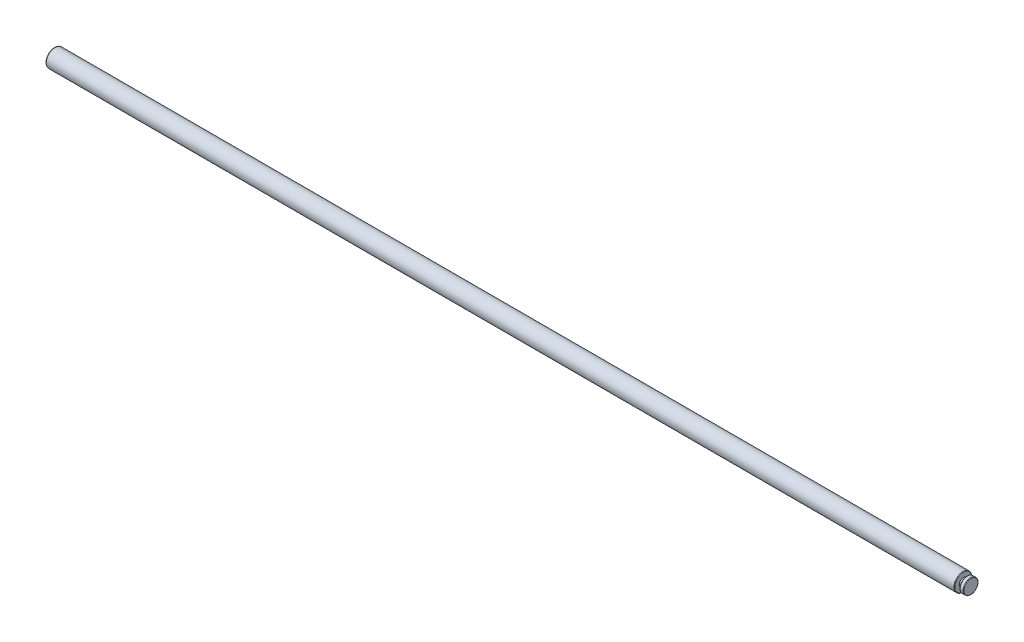
ISO-10303-21;
HEADER;
FILE_DESCRIPTION(('STEP AP214'),'2;1');
FILE_NAME('part.step','',(''),(''),'','','');
FILE_SCHEMA(('AUTOMOTIVE_DESIGN { 1 0 10303 214 1 1 1 1 }'));
ENDSEC;
DATA;
#1=APPLICATION_CONTEXT('core data for automotive mechanical design processes');
#2=APPLICATION_PROTOCOL_DEFINITION('international standard','automotive_design',2000,#1);
#3=PRODUCT_CONTEXT('',#1,'mechanical');
#4=PRODUCT('Part','Part','',(#3));
#5=PRODUCT_RELATED_PRODUCT_CATEGORY('part','',(#4));
#6=PRODUCT_DEFINITION_FORMATION('','',#4);
#7=PRODUCT_DEFINITION_CONTEXT('part definition',#1,'design');
#8=PRODUCT_DEFINITION('design','',#6,#7);
#9=PRODUCT_DEFINITION_SHAPE('','',#8);
#10=(LENGTH_UNIT() NAMED_UNIT(*) SI_UNIT(.MILLI.,.METRE.));
#11=(NAMED_UNIT(*) PLANE_ANGLE_UNIT() SI_UNIT($,.RADIAN.));
#12=(NAMED_UNIT(*) SI_UNIT($,.STERADIAN.) SOLID_ANGLE_UNIT());
#13=UNCERTAINTY_MEASURE_WITH_UNIT(LENGTH_MEASURE(1.E-05),#10,'distance_accuracy_value','');
#14=(GEOMETRIC_REPRESENTATION_CONTEXT(3) GLOBAL_UNCERTAINTY_ASSIGNED_CONTEXT((#13)) GLOBAL_UNIT_ASSIGNED_CONTEXT((#10,
#11,#12)) REPRESENTATION_CONTEXT('',''));
#15=CARTESIAN_POINT('',(0.,0.,0.));
#16=DIRECTION('',(0.,0.,1.));
#17=DIRECTION('',(1.,0.,0.));
#18=AXIS2_PLACEMENT_3D('',#15,#16,#17);
#19=CARTESIAN_POINT('',(-180.,0.,0.));
#20=DIRECTION('',(1.,0.,0.));
#21=DIRECTION('',(0.,0.,-1.));
#22=AXIS2_PLACEMENT_3D('',#19,#20,#21);
#23=PLANE('',#22);
#24=CARTESIAN_POINT('',(-180.,0.,0.));
#25=DIRECTION('',(1.,0.,0.));
#26=DIRECTION('',(0.,0.,-1.));
#27=AXIS2_PLACEMENT_3D('',#24,#25,#26);
#28=CIRCLE('',#27,3.1);
#29=CARTESIAN_POINT('',(-180.,0.,-3.1));
#30=VERTEX_POINT('',#29);
#31=EDGE_CURVE('E38',#30,#30,#28,.F.);
#32=ORIENTED_EDGE('',*,*,#31,.T.);
#33=EDGE_LOOP('',(#32));
#34=FACE_BOUND('',#33,.T.);
#35=ADVANCED_FACE('F31',(#34),#23,.F.);
#36=CARTESIAN_POINT('',(-180.,0.,0.));
#37=DIRECTION('',(-1.,0.,0.));
#38=DIRECTION('',(0.,0.,1.));
#39=AXIS2_PLACEMENT_3D('',#36,#37,#38);
#40=CYLINDRICAL_SURFACE('',#39,3.5);
#41=CARTESIAN_POINT('',(-179.6,0.,0.));
#42=DIRECTION('',(1.,0.,0.));
#43=DIRECTION('',(0.,0.,-1.));
#44=AXIS2_PLACEMENT_3D('',#41,#42,#43);
#45=CIRCLE('',#44,3.5);
#46=CARTESIAN_POINT('',(-179.6,0.,-3.5));
#47=VERTEX_POINT('',#46);
#48=EDGE_CURVE('E10',#47,#47,#45,.T.);
#49=ORIENTED_EDGE('',*,*,#48,.T.);
#50=EDGE_LOOP('',(#49));
#51=FACE_BOUND('',#50,.T.);
#52=CARTESIAN_POINT('',(176.8,0.,0.));
#53=DIRECTION('',(-1.,0.,0.));
#54=DIRECTION('',(0.,0.,1.));
#55=AXIS2_PLACEMENT_3D('',#52,#53,#54);
#56=CIRCLE('',#55,3.5);
#57=CARTESIAN_POINT('',(176.8,0.,3.5));
#58=VERTEX_POINT('',#57);
#59=EDGE_CURVE('E60',#58,#58,#56,.T.);
#60=ORIENTED_EDGE('',*,*,#59,.T.);
#61=EDGE_LOOP('',(#60));
#62=FACE_BOUND('',#61,.T.);
#63=ADVANCED_FACE('F89',(#51,#62),#40,.T.);
#64=CARTESIAN_POINT('',(177.,3.5,0.));
#65=DIRECTION('',(-1.,0.,0.));
#66=DIRECTION('',(0.,0.,1.));
#67=AXIS2_PLACEMENT_3D('',#64,#65,#66);
#68=PLANE('',#67);
#69=CARTESIAN_POINT('',(177.,0.,0.));
#70=DIRECTION('',(-1.,0.,0.));
#71=DIRECTION('',(0.,0.,1.));
#72=AXIS2_PLACEMENT_3D('',#69,#70,#71);
#73=CIRCLE('',#72,3.3);
#74=CARTESIAN_POINT('',(177.,0.,3.3));
#75=VERTEX_POINT('',#74);
#76=EDGE_CURVE('E57',#75,#75,#73,.F.);
#77=ORIENTED_EDGE('',*,*,#76,.T.);
#78=EDGE_LOOP('',(#77));
#79=FACE_BOUND('',#78,.T.);
#80=CARTESIAN_POINT('',(177.,0.,0.));
#81=DIRECTION('',(-1.,0.,0.));
#82=DIRECTION('',(0.,0.,1.));
#83=AXIS2_PLACEMENT_3D('',#80,#81,#82);
#84=CIRCLE('',#83,1.5);
#85=CARTESIAN_POINT('',(177.,0.,1.5));
#86=VERTEX_POINT('',#85);
#87=EDGE_CURVE('E63',#86,#86,#84,.T.);
#88=ORIENTED_EDGE('',*,*,#87,.T.);
#89=EDGE_LOOP('',(#88));
#90=FACE_BOUND('',#89,.T.);
#91=ADVANCED_FACE('F85',(#79,#90),#68,.F.);
#92=CARTESIAN_POINT('',(-180.,0.,0.));
#93=DIRECTION('',(-1.,0.,0.));
#94=DIRECTION('',(0.,0.,1.));
#95=AXIS2_PLACEMENT_3D('',#92,#93,#94);
#96=CYLINDRICAL_SURFACE('',#95,1.5);
#97=ORIENTED_EDGE('',*,*,#87,.F.);
#98=EDGE_LOOP('',(#97));
#99=FACE_BOUND('',#98,.T.);
#100=CARTESIAN_POINT('',(178.5,0.,0.));
#101=DIRECTION('',(-1.,0.,0.));
#102=DIRECTION('',(0.,0.,1.));
#103=AXIS2_PLACEMENT_3D('',#100,#101,#102);
#104=CIRCLE('',#103,1.5);
#105=CARTESIAN_POINT('',(178.5,0.,1.5));
#106=VERTEX_POINT('',#105);
#107=EDGE_CURVE('E66',#106,#106,#104,.T.);
#108=ORIENTED_EDGE('',*,*,#107,.T.);
#109=EDGE_LOOP('',(#108));
#110=FACE_BOUND('',#109,.T.);
#111=ADVANCED_FACE('F70',(#99,#110),#96,.T.);
#112=CARTESIAN_POINT('',(178.5,1.5,0.));
#113=DIRECTION('',(1.,0.,0.));
#114=DIRECTION('',(0.,0.,-1.));
#115=AXIS2_PLACEMENT_3D('',#112,#113,#114);
#116=PLANE('',#115);
#117=CARTESIAN_POINT('',(178.5,0.,0.));
#118=DIRECTION('',(1.,0.,0.));
#119=DIRECTION('',(0.,0.,-1.));
#120=AXIS2_PLACEMENT_3D('',#117,#118,#119);
#121=CIRCLE('',#120,2.7);
#122=CARTESIAN_POINT('',(178.5,0.,-2.7));
#123=VERTEX_POINT('',#122);
#124=EDGE_CURVE('E54',#123,#123,#121,.F.);
#125=ORIENTED_EDGE('',*,*,#124,.T.);
#126=EDGE_LOOP('',(#125));
#127=FACE_BOUND('',#126,.T.);
#128=ORIENTED_EDGE('',*,*,#107,.F.);
#129=EDGE_LOOP('',(#128));
#130=FACE_BOUND('',#129,.T.);
#131=ADVANCED_FACE('F72',(#127,#130),#116,.F.);
#132=CARTESIAN_POINT('',(-180.,0.,0.));
#133=DIRECTION('',(-1.,0.,0.));
#134=DIRECTION('',(0.,0.,1.));
#135=AXIS2_PLACEMENT_3D('',#132,#133,#134);
#136=CYLINDRICAL_SURFACE('',#135,2.9);
#137=CARTESIAN_POINT('',(178.7,0.,0.));
#138=DIRECTION('',(1.,0.,0.));
#139=DIRECTION('',(0.,0.,-1.));
#140=AXIS2_PLACEMENT_3D('',#137,#138,#139);
#141=CIRCLE('',#140,2.9);
#142=CARTESIAN_POINT('',(178.7,0.,-2.9));
#143=VERTEX_POINT('',#142);
#144=EDGE_CURVE('E46',#143,#143,#141,.T.);
#145=ORIENTED_EDGE('',*,*,#144,.T.);
#146=EDGE_LOOP('',(#145));
#147=FACE_BOUND('',#146,.T.);
#148=CARTESIAN_POINT('',(179.8,0.,0.));
#149=DIRECTION('',(-1.,0.,0.));
#150=DIRECTION('',(0.,0.,1.));
#151=AXIS2_PLACEMENT_3D('',#148,#149,#150);
#152=CIRCLE('',#151,2.9);
#153=CARTESIAN_POINT('',(179.8,0.,2.9));
#154=VERTEX_POINT('',#153);
#155=EDGE_CURVE('E51',#154,#154,#152,.T.);
#156=ORIENTED_EDGE('',*,*,#155,.T.);
#157=EDGE_LOOP('',(#156));
#158=FACE_BOUND('',#157,.T.);
#159=ADVANCED_FACE('F74',(#147,#158),#136,.T.);
#160=CARTESIAN_POINT('',(180.,0.,0.));
#161=DIRECTION('',(-1.,0.,0.));
#162=DIRECTION('',(0.,0.,1.));
#163=AXIS2_PLACEMENT_3D('',#160,#161,#162);
#164=PLANE('',#163);
#165=CARTESIAN_POINT('',(180.,0.,0.));
#166=DIRECTION('',(-1.,0.,0.));
#167=DIRECTION('',(0.,0.,1.));
#168=AXIS2_PLACEMENT_3D('',#165,#166,#167);
#169=CIRCLE('',#168,2.7);
#170=CARTESIAN_POINT('',(180.,0.,2.7));
#171=VERTEX_POINT('',#170);
#172=EDGE_CURVE('E42',#171,#171,#169,.F.);
#173=ORIENTED_EDGE('',*,*,#172,.T.);
#174=EDGE_LOOP('',(#173));
#175=FACE_BOUND('',#174,.T.);
#176=ADVANCED_FACE('F81',(#175),#164,.F.);
#177=CARTESIAN_POINT('',(176.8,0.,0.));
#178=DIRECTION('',(-1.,0.,0.));
#179=DIRECTION('',(0.,0.,1.));
#180=AXIS2_PLACEMENT_3D('',#177,#178,#179);
#181=TOROIDAL_SURFACE('',#180,3.3,0.2);
#182=ORIENTED_EDGE('',*,*,#76,.F.);
#183=EDGE_LOOP('',(#182));
#184=FACE_BOUND('',#183,.T.);
#185=ORIENTED_EDGE('',*,*,#59,.F.);
#186=EDGE_LOOP('',(#185));
#187=FACE_BOUND('',#186,.T.);
#188=ADVANCED_FACE('F98',(#184,#187),#181,.T.);
#189=CARTESIAN_POINT('',(178.7,0.,0.));
#190=DIRECTION('',(1.,0.,0.));
#191=DIRECTION('',(0.,0.,-1.));
#192=AXIS2_PLACEMENT_3D('',#189,#190,#191);
#193=TOROIDAL_SURFACE('',#192,2.7,0.2);
#194=ORIENTED_EDGE('',*,*,#144,.F.);
#195=EDGE_LOOP('',(#194));
#196=FACE_BOUND('',#195,.T.);
#197=ORIENTED_EDGE('',*,*,#124,.F.);
#198=EDGE_LOOP('',(#197));
#199=FACE_BOUND('',#198,.T.);
#200=ADVANCED_FACE('F101',(#196,#199),#193,.T.);
#201=CARTESIAN_POINT('',(179.8,0.,0.));
#202=DIRECTION('',(-1.,0.,0.));
#203=DIRECTION('',(0.,0.,1.));
#204=AXIS2_PLACEMENT_3D('',#201,#202,#203);
#205=TOROIDAL_SURFACE('',#204,2.7,0.2);
#206=ORIENTED_EDGE('',*,*,#172,.F.);
#207=EDGE_LOOP('',(#206));
#208=FACE_BOUND('',#207,.T.);
#209=ORIENTED_EDGE('',*,*,#155,.F.);
#210=EDGE_LOOP('',(#209));
#211=FACE_BOUND('',#210,.T.);
#212=ADVANCED_FACE('F104',(#208,#211),#205,.T.);
#213=CARTESIAN_POINT('',(-179.6,0.,0.));
#214=DIRECTION('',(1.,0.,0.));
#215=DIRECTION('',(0.,0.,-1.));
#216=AXIS2_PLACEMENT_3D('',#213,#214,#215);
#217=TOROIDAL_SURFACE('',#216,3.1,0.4);
#218=ORIENTED_EDGE('',*,*,#48,.F.);
#219=EDGE_LOOP('',(#218));
#220=FACE_BOUND('',#219,.T.);
#221=ORIENTED_EDGE('',*,*,#31,.F.);
#222=EDGE_LOOP('',(#221));
#223=FACE_BOUND('',#222,.T.);
#224=ADVANCED_FACE('F33',(#220,#223),#217,.T.);
#225=CLOSED_SHELL('',(#35,#63,#91,#111,#131,#159,#176,#188,#200,#212,#224));
#226=MANIFOLD_SOLID_BREP('B2',#225);
#227=ADVANCED_BREP_SHAPE_REPRESENTATION('',(#18,#226),#14);
#228=SHAPE_DEFINITION_REPRESENTATION(#9,#227);
ENDSEC;
END-ISO-10303-21;
